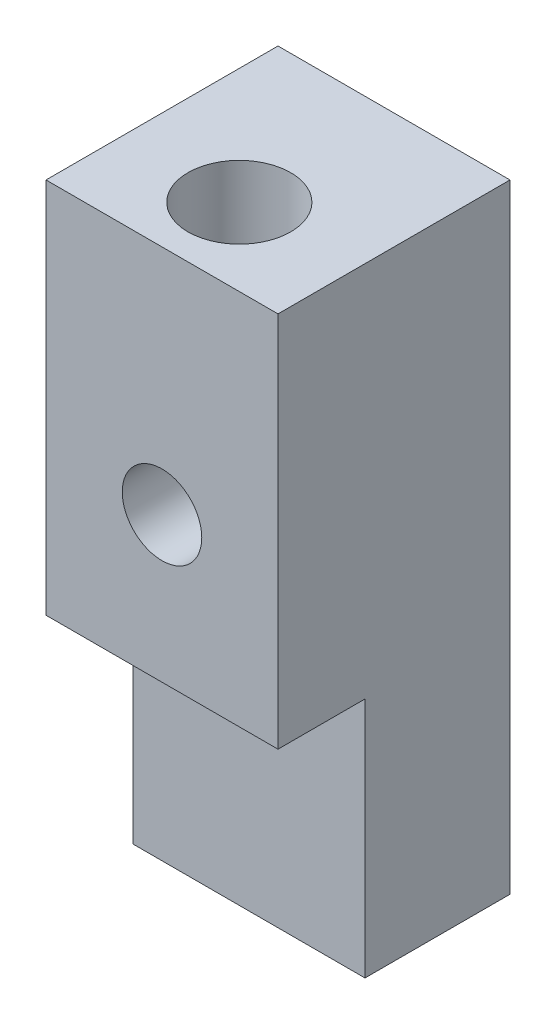
ISO-10303-21;
HEADER;
FILE_DESCRIPTION(('STEP AP214'),'2;1');
FILE_NAME('part.step','',(''),(''),'','','');
FILE_SCHEMA(('AUTOMOTIVE_DESIGN { 1 0 10303 214 1 1 1 1 }'));
ENDSEC;
DATA;
#1=APPLICATION_CONTEXT('core data for automotive mechanical design processes');
#2=APPLICATION_PROTOCOL_DEFINITION('international standard','automotive_design',2000,#1);
#3=PRODUCT_CONTEXT('',#1,'mechanical');
#4=PRODUCT('Part','Part','',(#3));
#5=PRODUCT_RELATED_PRODUCT_CATEGORY('part','',(#4));
#6=PRODUCT_DEFINITION_FORMATION('','',#4);
#7=PRODUCT_DEFINITION_CONTEXT('part definition',#1,'design');
#8=PRODUCT_DEFINITION('design','',#6,#7);
#9=PRODUCT_DEFINITION_SHAPE('','',#8);
#10=(LENGTH_UNIT() NAMED_UNIT(*) SI_UNIT(.MILLI.,.METRE.));
#11=(NAMED_UNIT(*) PLANE_ANGLE_UNIT() SI_UNIT($,.RADIAN.));
#12=(NAMED_UNIT(*) SI_UNIT($,.STERADIAN.) SOLID_ANGLE_UNIT());
#13=UNCERTAINTY_MEASURE_WITH_UNIT(LENGTH_MEASURE(1.E-05),#10,'distance_accuracy_value','');
#14=(GEOMETRIC_REPRESENTATION_CONTEXT(3) GLOBAL_UNCERTAINTY_ASSIGNED_CONTEXT((#13)) GLOBAL_UNIT_ASSIGNED_CONTEXT((#10,
#11,#12)) REPRESENTATION_CONTEXT('',''));
#15=CARTESIAN_POINT('',(0.,0.,0.));
#16=DIRECTION('',(0.,0.,1.));
#17=DIRECTION('',(1.,0.,0.));
#18=AXIS2_PLACEMENT_3D('',#15,#16,#17);
#19=CARTESIAN_POINT('',(19.05,19.84375,0.));
#20=DIRECTION('',(0.,0.,-1.));
#21=DIRECTION('',(-1.,0.,0.));
#22=AXIS2_PLACEMENT_3D('',#19,#20,#21);
#23=PLANE('',#22);
#24=DIRECTION('',(0.,-1.,0.));
#25=VECTOR('',#24,1.);
#26=CARTESIAN_POINT('',(0.,19.84375,0.));
#27=LINE('',#26,#25);
#28=CARTESIAN_POINT('',(0.,19.84375,0.));
#29=VERTEX_POINT('',#28);
#30=CARTESIAN_POINT('',(0.,0.,0.));
#31=VERTEX_POINT('',#30);
#32=EDGE_CURVE('E111',#29,#31,#27,.T.);
#33=ORIENTED_EDGE('',*,*,#32,.T.);
#34=DIRECTION('',(-1.,0.,0.));
#35=VECTOR('',#34,1.);
#36=CARTESIAN_POINT('',(19.05,0.,0.));
#37=LINE('',#36,#35);
#38=CARTESIAN_POINT('',(19.05,0.,0.));
#39=VERTEX_POINT('',#38);
#40=EDGE_CURVE('E11',#39,#31,#37,.T.);
#41=ORIENTED_EDGE('',*,*,#40,.F.);
#42=DIRECTION('',(0.,-1.,0.));
#43=VECTOR('',#42,1.);
#44=CARTESIAN_POINT('',(19.05,19.84375,0.));
#45=LINE('',#44,#43);
#46=CARTESIAN_POINT('',(19.05,19.84375,0.));
#47=VERTEX_POINT('',#46);
#48=EDGE_CURVE('E124',#47,#39,#45,.T.);
#49=ORIENTED_EDGE('',*,*,#48,.F.);
#50=DIRECTION('',(-1.,0.,0.));
#51=VECTOR('',#50,1.);
#52=CARTESIAN_POINT('',(19.05,19.84375,0.));
#53=LINE('',#52,#51);
#54=EDGE_CURVE('E134',#47,#29,#53,.T.);
#55=ORIENTED_EDGE('',*,*,#54,.T.);
#56=EDGE_LOOP('',(#33,#41,#49,#55));
#57=FACE_BOUND('',#56,.T.);
#58=ADVANCED_FACE('F38',(#57),#23,.F.);
#59=CARTESIAN_POINT('',(19.05,0.,0.));
#60=DIRECTION('',(0.,1.,0.));
#61=DIRECTION('',(0.,0.,1.));
#62=AXIS2_PLACEMENT_3D('',#59,#60,#61);
#63=PLANE('',#62);
#64=DIRECTION('',(0.,0.,-1.));
#65=VECTOR('',#64,1.);
#66=CARTESIAN_POINT('',(0.,0.,0.));
#67=LINE('',#66,#65);
#68=CARTESIAN_POINT('',(0.,0.,-11.90625));
#69=VERTEX_POINT('',#68);
#70=EDGE_CURVE('E114',#31,#69,#67,.T.);
#71=ORIENTED_EDGE('',*,*,#70,.T.);
#72=DIRECTION('',(-1.,0.,0.));
#73=VECTOR('',#72,1.);
#74=CARTESIAN_POINT('',(19.05,0.,-11.90625));
#75=LINE('',#74,#73);
#76=CARTESIAN_POINT('',(19.05,0.,-11.90625));
#77=VERTEX_POINT('',#76);
#78=EDGE_CURVE('E45',#77,#69,#75,.T.);
#79=ORIENTED_EDGE('',*,*,#78,.F.);
#80=DIRECTION('',(0.,0.,-1.));
#81=VECTOR('',#80,1.);
#82=CARTESIAN_POINT('',(19.05,0.,0.));
#83=LINE('',#82,#81);
#84=EDGE_CURVE('E126',#39,#77,#83,.T.);
#85=ORIENTED_EDGE('',*,*,#84,.F.);
#86=ORIENTED_EDGE('',*,*,#40,.T.);
#87=EDGE_LOOP('',(#71,#79,#85,#86));
#88=FACE_BOUND('',#87,.T.);
#89=ADVANCED_FACE('F171',(#88),#63,.F.);
#90=CARTESIAN_POINT('',(19.05,0.,-11.90625));
#91=DIRECTION('',(0.,0.,1.));
#92=DIRECTION('',(0.,-1.,0.));
#93=AXIS2_PLACEMENT_3D('',#90,#91,#92);
#94=PLANE('',#93);
#95=CARTESIAN_POINT('',(9.525,31.75,-11.90625));
#96=DIRECTION('',(0.,0.,1.));
#97=DIRECTION('',(1.,0.,0.));
#98=AXIS2_PLACEMENT_3D('',#95,#96,#97);
#99=CIRCLE('',#98,3.2639);
#100=CARTESIAN_POINT('',(12.7889,31.75,-11.90625));
#101=VERTEX_POINT('',#100);
#102=EDGE_CURVE('E103',#101,#101,#99,.T.);
#103=ORIENTED_EDGE('',*,*,#102,.T.);
#104=EDGE_LOOP('',(#103));
#105=FACE_BOUND('',#104,.T.);
#106=DIRECTION('',(0.,1.,0.));
#107=VECTOR('',#106,1.);
#108=CARTESIAN_POINT('',(0.,0.,-11.90625));
#109=LINE('',#108,#107);
#110=CARTESIAN_POINT('',(0.,50.8,-11.90625));
#111=VERTEX_POINT('',#110);
#112=EDGE_CURVE('E116',#69,#111,#109,.T.);
#113=ORIENTED_EDGE('',*,*,#112,.T.);
#114=DIRECTION('',(-1.,0.,0.));
#115=VECTOR('',#114,1.);
#116=CARTESIAN_POINT('',(19.05,50.8,-11.90625));
#117=LINE('',#116,#115);
#118=CARTESIAN_POINT('',(19.05,50.8,-11.90625));
#119=VERTEX_POINT('',#118);
#120=EDGE_CURVE('E143',#119,#111,#117,.T.);
#121=ORIENTED_EDGE('',*,*,#120,.F.);
#122=DIRECTION('',(0.,1.,0.));
#123=VECTOR('',#122,1.);
#124=CARTESIAN_POINT('',(19.05,0.,-11.90625));
#125=LINE('',#124,#123);
#126=EDGE_CURVE('E128',#77,#119,#125,.T.);
#127=ORIENTED_EDGE('',*,*,#126,.F.);
#128=ORIENTED_EDGE('',*,*,#78,.T.);
#129=EDGE_LOOP('',(#113,#121,#127,#128));
#130=FACE_BOUND('',#129,.T.);
#131=ADVANCED_FACE('F150',(#105,#130),#94,.F.);
#132=CARTESIAN_POINT('',(19.05,50.8,-11.90625));
#133=DIRECTION('',(0.,-1.,0.));
#134=DIRECTION('',(0.,0.,-1.));
#135=AXIS2_PLACEMENT_3D('',#132,#133,#134);
#136=PLANE('',#135);
#137=CARTESIAN_POINT('',(9.525,50.8,0.79375000000002));
#138=DIRECTION('',(0.,1.,0.));
#139=DIRECTION('',(0.,0.,1.));
#140=AXIS2_PLACEMENT_3D('',#137,#138,#139);
#141=CIRCLE('',#140,4.2164);
#142=CARTESIAN_POINT('',(9.525,50.8,5.01015000000002));
#143=VERTEX_POINT('',#142);
#144=EDGE_CURVE('E100',#143,#143,#141,.T.);
#145=ORIENTED_EDGE('',*,*,#144,.F.);
#146=EDGE_LOOP('',(#145));
#147=FACE_BOUND('',#146,.T.);
#148=DIRECTION('',(0.,0.,1.));
#149=VECTOR('',#148,1.);
#150=CARTESIAN_POINT('',(0.,50.8,-11.90625));
#151=LINE('',#150,#149);
#152=CARTESIAN_POINT('',(0.,50.8,7.14375000000002));
#153=VERTEX_POINT('',#152);
#154=EDGE_CURVE('E118',#111,#153,#151,.T.);
#155=ORIENTED_EDGE('',*,*,#154,.T.);
#156=DIRECTION('',(-1.,0.,0.));
#157=VECTOR('',#156,1.);
#158=CARTESIAN_POINT('',(19.05,50.8,7.14375000000002));
#159=LINE('',#158,#157);
#160=CARTESIAN_POINT('',(19.05,50.8,7.14375000000002));
#161=VERTEX_POINT('',#160);
#162=EDGE_CURVE('E140',#161,#153,#159,.T.);
#163=ORIENTED_EDGE('',*,*,#162,.F.);
#164=DIRECTION('',(0.,0.,1.));
#165=VECTOR('',#164,1.);
#166=CARTESIAN_POINT('',(19.05,50.8,-11.90625));
#167=LINE('',#166,#165);
#168=EDGE_CURVE('E130',#119,#161,#167,.T.);
#169=ORIENTED_EDGE('',*,*,#168,.F.);
#170=ORIENTED_EDGE('',*,*,#120,.T.);
#171=EDGE_LOOP('',(#155,#163,#169,#170));
#172=FACE_BOUND('',#171,.T.);
#173=ADVANCED_FACE('F161',(#147,#172),#136,.F.);
#174=CARTESIAN_POINT('',(19.05,50.8,7.14375000000002));
#175=DIRECTION('',(0.,0.,-1.));
#176=DIRECTION('',(0.,1.,0.));
#177=AXIS2_PLACEMENT_3D('',#174,#175,#176);
#178=PLANE('',#177);
#179=CARTESIAN_POINT('',(9.525,31.75,7.14375));
#180=DIRECTION('',(0.,0.,1.));
#181=DIRECTION('',(1.,0.,0.));
#182=AXIS2_PLACEMENT_3D('',#179,#180,#181);
#183=CIRCLE('',#182,3.26389999999999);
#184=CARTESIAN_POINT('',(12.7889,31.75,7.14375));
#185=VERTEX_POINT('',#184);
#186=EDGE_CURVE('E108',#185,#185,#183,.T.);
#187=ORIENTED_EDGE('',*,*,#186,.F.);
#188=EDGE_LOOP('',(#187));
#189=FACE_BOUND('',#188,.T.);
#190=DIRECTION('',(0.,-1.,0.));
#191=VECTOR('',#190,1.);
#192=CARTESIAN_POINT('',(0.,50.8,7.14375000000002));
#193=LINE('',#192,#191);
#194=CARTESIAN_POINT('',(0.,19.84375,7.14375000000001));
#195=VERTEX_POINT('',#194);
#196=EDGE_CURVE('E120',#153,#195,#193,.T.);
#197=ORIENTED_EDGE('',*,*,#196,.T.);
#198=DIRECTION('',(-1.,0.,0.));
#199=VECTOR('',#198,1.);
#200=CARTESIAN_POINT('',(19.05,19.84375,7.14375000000001));
#201=LINE('',#200,#199);
#202=CARTESIAN_POINT('',(19.05,19.84375,7.14375000000001));
#203=VERTEX_POINT('',#202);
#204=EDGE_CURVE('E137',#203,#195,#201,.T.);
#205=ORIENTED_EDGE('',*,*,#204,.F.);
#206=DIRECTION('',(0.,-1.,0.));
#207=VECTOR('',#206,1.);
#208=CARTESIAN_POINT('',(19.05,50.8,7.14375000000002));
#209=LINE('',#208,#207);
#210=EDGE_CURVE('E57',#161,#203,#209,.T.);
#211=ORIENTED_EDGE('',*,*,#210,.F.);
#212=ORIENTED_EDGE('',*,*,#162,.T.);
#213=EDGE_LOOP('',(#197,#205,#211,#212));
#214=FACE_BOUND('',#213,.T.);
#215=ADVANCED_FACE('F164',(#189,#214),#178,.F.);
#216=CARTESIAN_POINT('',(19.05,19.84375,7.14375000000001));
#217=DIRECTION('',(0.,1.,0.));
#218=DIRECTION('',(0.,0.,1.));
#219=AXIS2_PLACEMENT_3D('',#216,#217,#218);
#220=PLANE('',#219);
#221=DIRECTION('',(0.,0.,-1.));
#222=VECTOR('',#221,1.);
#223=CARTESIAN_POINT('',(0.,19.84375,7.14375000000001));
#224=LINE('',#223,#222);
#225=EDGE_CURVE('E122',#195,#29,#224,.T.);
#226=ORIENTED_EDGE('',*,*,#225,.T.);
#227=ORIENTED_EDGE('',*,*,#54,.F.);
#228=DIRECTION('',(0.,0.,-1.));
#229=VECTOR('',#228,1.);
#230=CARTESIAN_POINT('',(19.05,19.84375,7.14375000000001));
#231=LINE('',#230,#229);
#232=EDGE_CURVE('E52',#203,#47,#231,.T.);
#233=ORIENTED_EDGE('',*,*,#232,.F.);
#234=ORIENTED_EDGE('',*,*,#204,.T.);
#235=EDGE_LOOP('',(#226,#227,#233,#234));
#236=FACE_BOUND('',#235,.T.);
#237=ADVANCED_FACE('F166',(#236),#220,.F.);
#238=CARTESIAN_POINT('',(19.05,0.,0.));
#239=DIRECTION('',(1.,0.,0.));
#240=DIRECTION('',(0.,0.,-1.));
#241=AXIS2_PLACEMENT_3D('',#238,#239,#240);
#242=PLANE('',#241);
#243=ORIENTED_EDGE('',*,*,#48,.T.);
#244=ORIENTED_EDGE('',*,*,#84,.T.);
#245=ORIENTED_EDGE('',*,*,#126,.T.);
#246=ORIENTED_EDGE('',*,*,#168,.T.);
#247=ORIENTED_EDGE('',*,*,#210,.T.);
#248=ORIENTED_EDGE('',*,*,#232,.T.);
#249=EDGE_LOOP('',(#243,#244,#245,#246,#247,#248));
#250=FACE_BOUND('',#249,.T.);
#251=ADVANCED_FACE('F170',(#250),#242,.T.);
#252=CARTESIAN_POINT('',(0.,0.,0.));
#253=DIRECTION('',(1.,0.,0.));
#254=DIRECTION('',(0.,0.,-1.));
#255=AXIS2_PLACEMENT_3D('',#252,#253,#254);
#256=PLANE('',#255);
#257=ORIENTED_EDGE('',*,*,#32,.F.);
#258=ORIENTED_EDGE('',*,*,#225,.F.);
#259=ORIENTED_EDGE('',*,*,#196,.F.);
#260=ORIENTED_EDGE('',*,*,#154,.F.);
#261=ORIENTED_EDGE('',*,*,#112,.F.);
#262=ORIENTED_EDGE('',*,*,#70,.F.);
#263=EDGE_LOOP('',(#257,#258,#259,#260,#261,#262));
#264=FACE_BOUND('',#263,.T.);
#265=ADVANCED_FACE('F156',(#264),#256,.F.);
#266=CARTESIAN_POINT('',(9.525,31.75,7.14375));
#267=DIRECTION('',(0.,0.,1.));
#268=DIRECTION('',(1.,0.,0.));
#269=AXIS2_PLACEMENT_3D('',#266,#267,#268);
#270=CYLINDRICAL_SURFACE('',#269,3.26389999999999);
#271=ORIENTED_EDGE('',*,*,#102,.F.);
#272=EDGE_LOOP('',(#271));
#273=FACE_BOUND('',#272,.T.);
#274=ORIENTED_EDGE('',*,*,#186,.T.);
#275=EDGE_LOOP('',(#274));
#276=FACE_BOUND('',#275,.T.);
#277=ADVANCED_FACE('F192',(#273,#276),#270,.F.);
#278=CARTESIAN_POINT('',(9.525,50.8,0.79375000000002));
#279=DIRECTION('',(0.,1.,0.));
#280=DIRECTION('',(0.,0.,1.));
#281=AXIS2_PLACEMENT_3D('',#278,#279,#280);
#282=CYLINDRICAL_SURFACE('',#281,4.2164);
#283=CARTESIAN_POINT('',(9.525,38.1,0.79375000000002));
#284=DIRECTION('',(0.,1.,0.));
#285=DIRECTION('',(0.,0.,1.));
#286=AXIS2_PLACEMENT_3D('',#283,#284,#285);
#287=CIRCLE('',#286,4.2164);
#288=CARTESIAN_POINT('',(9.525,38.1,5.01015000000002));
#289=VERTEX_POINT('',#288);
#290=EDGE_CURVE('E98',#289,#289,#287,.T.);
#291=ORIENTED_EDGE('',*,*,#290,.F.);
#292=EDGE_LOOP('',(#291));
#293=FACE_BOUND('',#292,.T.);
#294=ORIENTED_EDGE('',*,*,#144,.T.);
#295=EDGE_LOOP('',(#294));
#296=FACE_BOUND('',#295,.T.);
#297=ADVANCED_FACE('F94',(#293,#296),#282,.F.);
#298=CARTESIAN_POINT('',(9.525,38.1,0.79375000000002));
#299=DIRECTION('',(0.,1.,0.));
#300=DIRECTION('',(0.,0.,1.));
#301=AXIS2_PLACEMENT_3D('',#298,#299,#300);
#302=CONICAL_SURFACE('',#301,4.2164,1.02974425867665);
#303=CARTESIAN_POINT('',(9.525,35.5665312859322,0.79375000000002));
#304=VERTEX_POINT('',#303);
#305=VERTEX_LOOP('',#304);
#306=FACE_BOUND('',#305,.T.);
#307=ORIENTED_EDGE('',*,*,#290,.T.);
#308=EDGE_LOOP('',(#307));
#309=FACE_BOUND('',#308,.T.);
#310=ADVANCED_FACE('F91',(#306,#309),#302,.F.);
#311=CLOSED_SHELL('',(#58,#89,#131,#173,#215,#237,#251,#265,#277,#297,#310));
#312=MANIFOLD_SOLID_BREP('B2',#311);
#313=ADVANCED_BREP_SHAPE_REPRESENTATION('',(#18,#312),#14);
#314=SHAPE_DEFINITION_REPRESENTATION(#9,#313);
ENDSEC;
END-ISO-10303-21;
